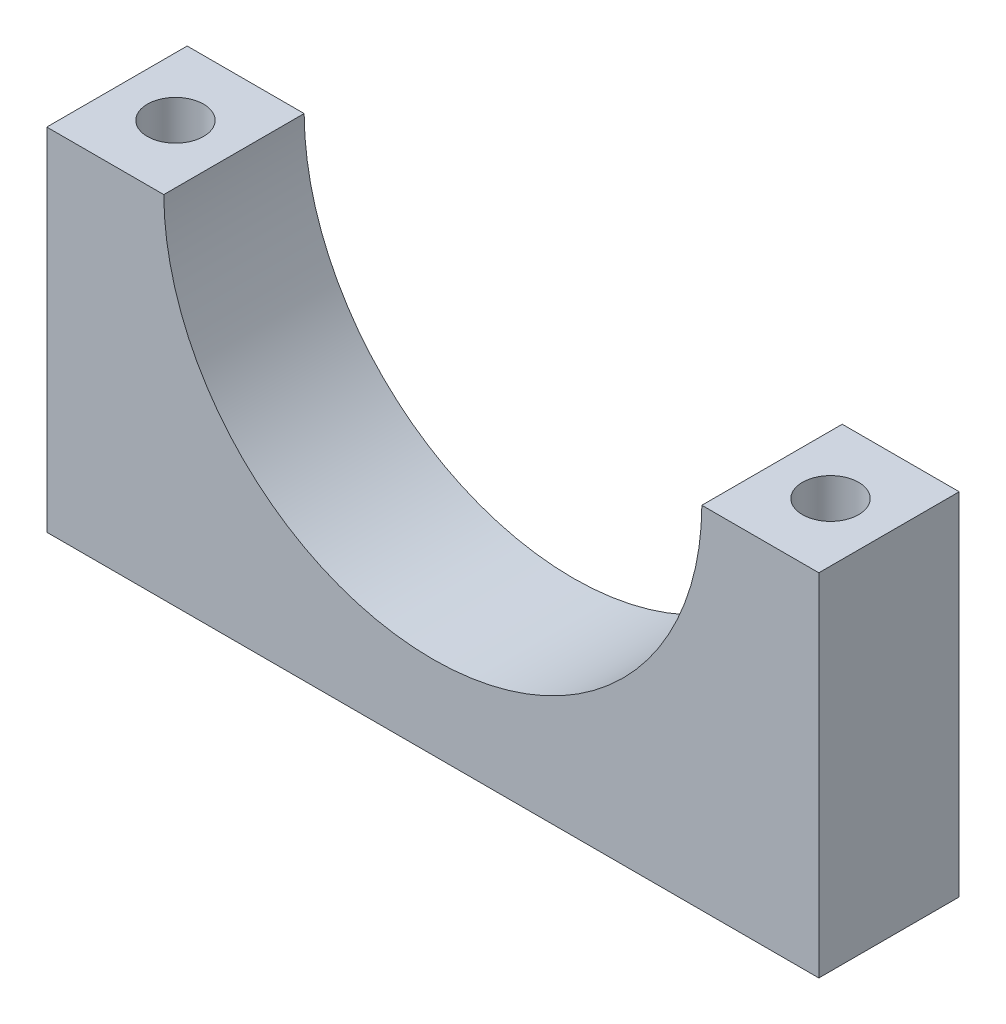
ISO-10303-21;
HEADER;
FILE_DESCRIPTION(('STEP AP214'),'2;1');
FILE_NAME('part.step','',(''),(''),'','','');
FILE_SCHEMA(('AUTOMOTIVE_DESIGN { 1 0 10303 214 1 1 1 1 }'));
ENDSEC;
DATA;
#1=APPLICATION_CONTEXT('core data for automotive mechanical design processes');
#2=APPLICATION_PROTOCOL_DEFINITION('international standard','automotive_design',2000,#1);
#3=PRODUCT_CONTEXT('',#1,'mechanical');
#4=PRODUCT('Part','Part','',(#3));
#5=PRODUCT_RELATED_PRODUCT_CATEGORY('part','',(#4));
#6=PRODUCT_DEFINITION_FORMATION('','',#4);
#7=PRODUCT_DEFINITION_CONTEXT('part definition',#1,'design');
#8=PRODUCT_DEFINITION('design','',#6,#7);
#9=PRODUCT_DEFINITION_SHAPE('','',#8);
#10=(LENGTH_UNIT() NAMED_UNIT(*) SI_UNIT(.MILLI.,.METRE.));
#11=(NAMED_UNIT(*) PLANE_ANGLE_UNIT() SI_UNIT($,.RADIAN.));
#12=(NAMED_UNIT(*) SI_UNIT($,.STERADIAN.) SOLID_ANGLE_UNIT());
#13=UNCERTAINTY_MEASURE_WITH_UNIT(LENGTH_MEASURE(1.E-05),#10,'distance_accuracy_value','');
#14=(GEOMETRIC_REPRESENTATION_CONTEXT(3) GLOBAL_UNCERTAINTY_ASSIGNED_CONTEXT((#13)) GLOBAL_UNIT_ASSIGNED_CONTEXT((#10,
#11,#12)) REPRESENTATION_CONTEXT('',''));
#15=CARTESIAN_POINT('',(0.,0.,0.));
#16=DIRECTION('',(0.,0.,1.));
#17=DIRECTION('',(1.,0.,0.));
#18=AXIS2_PLACEMENT_3D('',#15,#16,#17);
#19=CARTESIAN_POINT('',(0.,30.,12.));
#20=DIRECTION('',(0.,-1.,0.));
#21=DIRECTION('',(0.,0.,-1.));
#22=AXIS2_PLACEMENT_3D('',#19,#20,#21);
#23=PLANE('',#22);
#24=CARTESIAN_POINT('',(61.,30.,6.));
#25=DIRECTION('',(0.,-1.,0.));
#26=DIRECTION('',(0.,0.,-1.));
#27=AXIS2_PLACEMENT_3D('',#24,#25,#26);
#28=CIRCLE('',#27,2.39999999999999);
#29=CARTESIAN_POINT('',(61.,30.,3.60000000000001));
#30=VERTEX_POINT('',#29);
#31=EDGE_CURVE('E154',#30,#30,#28,.T.);
#32=ORIENTED_EDGE('',*,*,#31,.T.);
#33=EDGE_LOOP('',(#32));
#34=FACE_BOUND('',#33,.T.);
#35=DIRECTION('',(-1.,0.,0.));
#36=VECTOR('',#35,1.);
#37=CARTESIAN_POINT('',(0.,30.,0.));
#38=LINE('',#37,#36);
#39=CARTESIAN_POINT('',(66.,30.,0.));
#40=VERTEX_POINT('',#39);
#41=CARTESIAN_POINT('',(55.9997826076683,30.,0.));
#42=VERTEX_POINT('',#41);
#43=EDGE_CURVE('E107',#40,#42,#38,.T.);
#44=ORIENTED_EDGE('',*,*,#43,.T.);
#45=DIRECTION('',(0.,0.,1.));
#46=VECTOR('',#45,1.);
#47=CARTESIAN_POINT('',(55.9997826076683,30.,0.));
#48=LINE('',#47,#46);
#49=CARTESIAN_POINT('',(55.9997826076683,30.,12.));
#50=VERTEX_POINT('',#49);
#51=EDGE_CURVE('E48',#42,#50,#48,.T.);
#52=ORIENTED_EDGE('',*,*,#51,.T.);
#53=DIRECTION('',(-1.,0.,0.));
#54=VECTOR('',#53,1.);
#55=CARTESIAN_POINT('',(0.,30.,12.));
#56=LINE('',#55,#54);
#57=CARTESIAN_POINT('',(66.,30.,12.));
#58=VERTEX_POINT('',#57);
#59=EDGE_CURVE('E118',#58,#50,#56,.T.);
#60=ORIENTED_EDGE('',*,*,#59,.F.);
#61=DIRECTION('',(0.,0.,-1.));
#62=VECTOR('',#61,1.);
#63=CARTESIAN_POINT('',(66.,30.,12.));
#64=LINE('',#63,#62);
#65=EDGE_CURVE('E117',#58,#40,#64,.T.);
#66=ORIENTED_EDGE('',*,*,#65,.T.);
#67=EDGE_LOOP('',(#44,#52,#60,#66));
#68=FACE_BOUND('',#67,.T.);
#69=ADVANCED_FACE('F33',(#34,#68),#23,.F.);
#70=CARTESIAN_POINT('',(0.,0.,12.));
#71=DIRECTION('',(1.,0.,0.));
#72=DIRECTION('',(0.,0.,-1.));
#73=AXIS2_PLACEMENT_3D('',#70,#71,#72);
#74=PLANE('',#73);
#75=DIRECTION('',(0.,-1.,0.));
#76=VECTOR('',#75,1.);
#77=CARTESIAN_POINT('',(0.,0.,0.));
#78=LINE('',#77,#76);
#79=CARTESIAN_POINT('',(0.,30.,0.));
#80=VERTEX_POINT('',#79);
#81=CARTESIAN_POINT('',(0.,0.,0.));
#82=VERTEX_POINT('',#81);
#83=EDGE_CURVE('E106',#80,#82,#78,.T.);
#84=ORIENTED_EDGE('',*,*,#83,.T.);
#85=DIRECTION('',(0.,0.,-1.));
#86=VECTOR('',#85,1.);
#87=CARTESIAN_POINT('',(0.,0.,12.));
#88=LINE('',#87,#86);
#89=CARTESIAN_POINT('',(0.,0.,12.));
#90=VERTEX_POINT('',#89);
#91=EDGE_CURVE('E11',#90,#82,#88,.T.);
#92=ORIENTED_EDGE('',*,*,#91,.F.);
#93=DIRECTION('',(0.,-1.,0.));
#94=VECTOR('',#93,1.);
#95=CARTESIAN_POINT('',(0.,0.,12.));
#96=LINE('',#95,#94);
#97=CARTESIAN_POINT('',(0.,30.,12.));
#98=VERTEX_POINT('',#97);
#99=EDGE_CURVE('E110',#98,#90,#96,.T.);
#100=ORIENTED_EDGE('',*,*,#99,.F.);
#101=DIRECTION('',(0.,0.,-1.));
#102=VECTOR('',#101,1.);
#103=CARTESIAN_POINT('',(0.,30.,12.));
#104=LINE('',#103,#102);
#105=EDGE_CURVE('E115',#98,#80,#104,.T.);
#106=ORIENTED_EDGE('',*,*,#105,.T.);
#107=EDGE_LOOP('',(#84,#92,#100,#106));
#108=FACE_BOUND('',#107,.T.);
#109=ADVANCED_FACE('F35',(#108),#74,.F.);
#110=CARTESIAN_POINT('',(0.,0.,12.));
#111=DIRECTION('',(0.,1.,0.));
#112=DIRECTION('',(0.,0.,1.));
#113=AXIS2_PLACEMENT_3D('',#110,#111,#112);
#114=PLANE('',#113);
#115=CARTESIAN_POINT('',(61.,0.,6.));
#116=DIRECTION('',(0.,-1.,0.));
#117=DIRECTION('',(0.,0.,-1.));
#118=AXIS2_PLACEMENT_3D('',#115,#116,#117);
#119=CIRCLE('',#118,4.);
#120=CARTESIAN_POINT('',(61.,0.,2.));
#121=VERTEX_POINT('',#120);
#122=EDGE_CURVE('E163',#121,#121,#119,.T.);
#123=ORIENTED_EDGE('',*,*,#122,.F.);
#124=EDGE_LOOP('',(#123));
#125=FACE_BOUND('',#124,.T.);
#126=CARTESIAN_POINT('',(5.,0.,6.));
#127=DIRECTION('',(0.,-1.,0.));
#128=DIRECTION('',(0.,0.,-1.));
#129=AXIS2_PLACEMENT_3D('',#126,#127,#128);
#130=CIRCLE('',#129,3.99999999999999);
#131=CARTESIAN_POINT('',(5.,0.,2.00000000000001));
#132=VERTEX_POINT('',#131);
#133=EDGE_CURVE('E151',#132,#132,#130,.T.);
#134=ORIENTED_EDGE('',*,*,#133,.F.);
#135=EDGE_LOOP('',(#134));
#136=FACE_BOUND('',#135,.T.);
#137=DIRECTION('',(1.,0.,0.));
#138=VECTOR('',#137,1.);
#139=CARTESIAN_POINT('',(0.,0.,0.));
#140=LINE('',#139,#138);
#141=CARTESIAN_POINT('',(66.,0.,0.));
#142=VERTEX_POINT('',#141);
#143=EDGE_CURVE('E111',#82,#142,#140,.T.);
#144=ORIENTED_EDGE('',*,*,#143,.T.);
#145=DIRECTION('',(0.,0.,-1.));
#146=VECTOR('',#145,1.);
#147=CARTESIAN_POINT('',(66.,0.,12.));
#148=LINE('',#147,#146);
#149=CARTESIAN_POINT('',(66.,0.,12.));
#150=VERTEX_POINT('',#149);
#151=EDGE_CURVE('E41',#150,#142,#148,.T.);
#152=ORIENTED_EDGE('',*,*,#151,.F.);
#153=DIRECTION('',(1.,0.,0.));
#154=VECTOR('',#153,1.);
#155=CARTESIAN_POINT('',(0.,0.,12.));
#156=LINE('',#155,#154);
#157=EDGE_CURVE('E86',#90,#150,#156,.T.);
#158=ORIENTED_EDGE('',*,*,#157,.F.);
#159=ORIENTED_EDGE('',*,*,#91,.T.);
#160=EDGE_LOOP('',(#144,#152,#158,#159));
#161=FACE_BOUND('',#160,.T.);
#162=ADVANCED_FACE('F134',(#125,#136,#161),#114,.F.);
#163=CARTESIAN_POINT('',(66.,0.,12.));
#164=DIRECTION('',(-1.,0.,0.));
#165=DIRECTION('',(0.,0.,1.));
#166=AXIS2_PLACEMENT_3D('',#163,#164,#165);
#167=PLANE('',#166);
#168=DIRECTION('',(0.,1.,0.));
#169=VECTOR('',#168,1.);
#170=CARTESIAN_POINT('',(66.,0.,0.));
#171=LINE('',#170,#169);
#172=EDGE_CURVE('E108',#142,#40,#171,.T.);
#173=ORIENTED_EDGE('',*,*,#172,.T.);
#174=ORIENTED_EDGE('',*,*,#65,.F.);
#175=DIRECTION('',(0.,1.,0.));
#176=VECTOR('',#175,1.);
#177=CARTESIAN_POINT('',(66.,0.,12.));
#178=LINE('',#177,#176);
#179=EDGE_CURVE('E126',#150,#58,#178,.T.);
#180=ORIENTED_EDGE('',*,*,#179,.F.);
#181=ORIENTED_EDGE('',*,*,#151,.T.);
#182=EDGE_LOOP('',(#173,#174,#180,#181));
#183=FACE_BOUND('',#182,.T.);
#184=ADVANCED_FACE('F124',(#183),#167,.F.);
#185=CARTESIAN_POINT('',(5.,30.,6.));
#186=DIRECTION('',(0.,-1.,0.));
#187=DIRECTION('',(0.,0.,-1.));
#188=AXIS2_PLACEMENT_3D('',#185,#186,#187);
#189=CIRCLE('',#188,2.39999999999999);
#190=CARTESIAN_POINT('',(5.,30.,3.60000000000001));
#191=VERTEX_POINT('',#190);
#192=EDGE_CURVE('E141',#191,#191,#189,.T.);
#193=ORIENTED_EDGE('',*,*,#192,.T.);
#194=EDGE_LOOP('',(#193));
#195=FACE_BOUND('',#194,.T.);
#196=CARTESIAN_POINT('',(10.0002173923317,30.,12.));
#197=VERTEX_POINT('',#196);
#198=EDGE_CURVE('E57',#197,#98,#56,.T.);
#199=ORIENTED_EDGE('',*,*,#198,.F.);
#200=DIRECTION('',(0.,0.,1.));
#201=VECTOR('',#200,1.);
#202=CARTESIAN_POINT('',(10.0002173923317,30.,0.));
#203=LINE('',#202,#201);
#204=CARTESIAN_POINT('',(10.0002173923317,30.,0.));
#205=VERTEX_POINT('',#204);
#206=EDGE_CURVE('E95',#197,#205,#203,.F.);
#207=ORIENTED_EDGE('',*,*,#206,.T.);
#208=EDGE_CURVE('E79',#205,#80,#38,.T.);
#209=ORIENTED_EDGE('',*,*,#208,.T.);
#210=ORIENTED_EDGE('',*,*,#105,.F.);
#211=EDGE_LOOP('',(#199,#207,#209,#210));
#212=FACE_BOUND('',#211,.T.);
#213=ADVANCED_FACE('F101',(#195,#212),#23,.F.);
#214=CARTESIAN_POINT('',(0.,30.,12.));
#215=DIRECTION('',(0.,0.,-1.));
#216=DIRECTION('',(-1.,0.,0.));
#217=AXIS2_PLACEMENT_3D('',#214,#215,#216);
#218=PLANE('',#217);
#219=ORIENTED_EDGE('',*,*,#59,.T.);
#220=CARTESIAN_POINT('',(33.,30.1,12.));
#221=DIRECTION('',(0.,0.,1.));
#222=DIRECTION('',(1.,0.,0.));
#223=AXIS2_PLACEMENT_3D('',#220,#221,#222);
#224=CIRCLE('',#223,23.);
#225=EDGE_CURVE('E99',#197,#50,#224,.T.);
#226=ORIENTED_EDGE('',*,*,#225,.F.);
#227=ORIENTED_EDGE('',*,*,#198,.T.);
#228=ORIENTED_EDGE('',*,*,#99,.T.);
#229=ORIENTED_EDGE('',*,*,#157,.T.);
#230=ORIENTED_EDGE('',*,*,#179,.T.);
#231=EDGE_LOOP('',(#219,#226,#227,#228,#229,#230));
#232=FACE_BOUND('',#231,.T.);
#233=ADVANCED_FACE('F200',(#232),#218,.F.);
#234=CARTESIAN_POINT('',(0.,30.,0.));
#235=DIRECTION('',(0.,0.,-1.));
#236=DIRECTION('',(-1.,0.,0.));
#237=AXIS2_PLACEMENT_3D('',#234,#235,#236);
#238=PLANE('',#237);
#239=CARTESIAN_POINT('',(33.,30.1,0.));
#240=DIRECTION('',(0.,0.,1.));
#241=DIRECTION('',(1.,0.,0.));
#242=AXIS2_PLACEMENT_3D('',#239,#240,#241);
#243=CIRCLE('',#242,23.);
#244=EDGE_CURVE('E93',#205,#42,#243,.T.);
#245=ORIENTED_EDGE('',*,*,#244,.T.);
#246=ORIENTED_EDGE('',*,*,#43,.F.);
#247=ORIENTED_EDGE('',*,*,#172,.F.);
#248=ORIENTED_EDGE('',*,*,#143,.F.);
#249=ORIENTED_EDGE('',*,*,#83,.F.);
#250=ORIENTED_EDGE('',*,*,#208,.F.);
#251=EDGE_LOOP('',(#245,#246,#247,#248,#249,#250));
#252=FACE_BOUND('',#251,.T.);
#253=ADVANCED_FACE('F104',(#252),#238,.T.);
#254=CARTESIAN_POINT('',(33.,30.1,0.));
#255=DIRECTION('',(0.,0.,1.));
#256=DIRECTION('',(1.,0.,0.));
#257=AXIS2_PLACEMENT_3D('',#254,#255,#256);
#258=CYLINDRICAL_SURFACE('',#257,23.);
#259=ORIENTED_EDGE('',*,*,#244,.F.);
#260=ORIENTED_EDGE('',*,*,#206,.F.);
#261=ORIENTED_EDGE('',*,*,#225,.T.);
#262=ORIENTED_EDGE('',*,*,#51,.F.);
#263=EDGE_LOOP('',(#259,#260,#261,#262));
#264=FACE_BOUND('',#263,.T.);
#265=ADVANCED_FACE('F94',(#264),#258,.F.);
#266=CARTESIAN_POINT('',(5.,0.,6.));
#267=DIRECTION('',(0.,-1.,0.));
#268=DIRECTION('',(0.,0.,-1.));
#269=AXIS2_PLACEMENT_3D('',#266,#267,#268);
#270=CYLINDRICAL_SURFACE('',#269,2.4);
#271=ORIENTED_EDGE('',*,*,#192,.F.);
#272=EDGE_LOOP('',(#271));
#273=FACE_BOUND('',#272,.T.);
#274=CARTESIAN_POINT('',(5.,4.,6.));
#275=DIRECTION('',(0.,-1.,0.));
#276=DIRECTION('',(0.,0.,-1.));
#277=AXIS2_PLACEMENT_3D('',#274,#275,#276);
#278=CIRCLE('',#277,2.4);
#279=CARTESIAN_POINT('',(5.,4.,3.6));
#280=VERTEX_POINT('',#279);
#281=EDGE_CURVE('E145',#280,#280,#278,.T.);
#282=ORIENTED_EDGE('',*,*,#281,.T.);
#283=EDGE_LOOP('',(#282));
#284=FACE_BOUND('',#283,.T.);
#285=ADVANCED_FACE('F186',(#273,#284),#270,.F.);
#286=CARTESIAN_POINT('',(7.4,4.,6.));
#287=DIRECTION('',(0.,1.,0.));
#288=DIRECTION('',(0.,0.,1.));
#289=AXIS2_PLACEMENT_3D('',#286,#287,#288);
#290=PLANE('',#289);
#291=ORIENTED_EDGE('',*,*,#281,.F.);
#292=EDGE_LOOP('',(#291));
#293=FACE_BOUND('',#292,.T.);
#294=CARTESIAN_POINT('',(5.,4.,6.));
#295=DIRECTION('',(0.,-1.,0.));
#296=DIRECTION('',(0.,0.,-1.));
#297=AXIS2_PLACEMENT_3D('',#294,#295,#296);
#298=CIRCLE('',#297,4.);
#299=CARTESIAN_POINT('',(5.,4.,2.));
#300=VERTEX_POINT('',#299);
#301=EDGE_CURVE('E148',#300,#300,#298,.T.);
#302=ORIENTED_EDGE('',*,*,#301,.T.);
#303=EDGE_LOOP('',(#302));
#304=FACE_BOUND('',#303,.T.);
#305=ADVANCED_FACE('F176',(#293,#304),#290,.F.);
#306=CARTESIAN_POINT('',(5.,0.,6.));
#307=DIRECTION('',(0.,-1.,0.));
#308=DIRECTION('',(0.,0.,-1.));
#309=AXIS2_PLACEMENT_3D('',#306,#307,#308);
#310=CYLINDRICAL_SURFACE('',#309,3.99999999999999);
#311=ORIENTED_EDGE('',*,*,#301,.F.);
#312=EDGE_LOOP('',(#311));
#313=FACE_BOUND('',#312,.T.);
#314=ORIENTED_EDGE('',*,*,#133,.T.);
#315=EDGE_LOOP('',(#314));
#316=FACE_BOUND('',#315,.T.);
#317=ADVANCED_FACE('F173',(#313,#316),#310,.F.);
#318=CARTESIAN_POINT('',(61.,0.,6.));
#319=DIRECTION('',(0.,-1.,0.));
#320=DIRECTION('',(0.,0.,-1.));
#321=AXIS2_PLACEMENT_3D('',#318,#319,#320);
#322=CYLINDRICAL_SURFACE('',#321,2.39999999999999);
#323=ORIENTED_EDGE('',*,*,#31,.F.);
#324=EDGE_LOOP('',(#323));
#325=FACE_BOUND('',#324,.T.);
#326=CARTESIAN_POINT('',(61.,4.,6.));
#327=DIRECTION('',(0.,-1.,0.));
#328=DIRECTION('',(0.,0.,-1.));
#329=AXIS2_PLACEMENT_3D('',#326,#327,#328);
#330=CIRCLE('',#329,2.39999999999999);
#331=CARTESIAN_POINT('',(61.,4.,3.60000000000001));
#332=VERTEX_POINT('',#331);
#333=EDGE_CURVE('E157',#332,#332,#330,.T.);
#334=ORIENTED_EDGE('',*,*,#333,.T.);
#335=EDGE_LOOP('',(#334));
#336=FACE_BOUND('',#335,.T.);
#337=ADVANCED_FACE('F175',(#325,#336),#322,.F.);
#338=CARTESIAN_POINT('',(63.4,4.,6.));
#339=DIRECTION('',(0.,1.,0.));
#340=DIRECTION('',(0.,0.,1.));
#341=AXIS2_PLACEMENT_3D('',#338,#339,#340);
#342=PLANE('',#341);
#343=ORIENTED_EDGE('',*,*,#333,.F.);
#344=EDGE_LOOP('',(#343));
#345=FACE_BOUND('',#344,.T.);
#346=CARTESIAN_POINT('',(61.,4.,6.));
#347=DIRECTION('',(0.,-1.,0.));
#348=DIRECTION('',(0.,0.,-1.));
#349=AXIS2_PLACEMENT_3D('',#346,#347,#348);
#350=CIRCLE('',#349,4.);
#351=CARTESIAN_POINT('',(61.,4.,2.));
#352=VERTEX_POINT('',#351);
#353=EDGE_CURVE('E160',#352,#352,#350,.T.);
#354=ORIENTED_EDGE('',*,*,#353,.T.);
#355=EDGE_LOOP('',(#354));
#356=FACE_BOUND('',#355,.T.);
#357=ADVANCED_FACE('F183',(#345,#356),#342,.F.);
#358=CARTESIAN_POINT('',(61.,0.,6.));
#359=DIRECTION('',(0.,-1.,0.));
#360=DIRECTION('',(0.,0.,-1.));
#361=AXIS2_PLACEMENT_3D('',#358,#359,#360);
#362=CYLINDRICAL_SURFACE('',#361,4.);
#363=ORIENTED_EDGE('',*,*,#353,.F.);
#364=EDGE_LOOP('',(#363));
#365=FACE_BOUND('',#364,.T.);
#366=ORIENTED_EDGE('',*,*,#122,.T.);
#367=EDGE_LOOP('',(#366));
#368=FACE_BOUND('',#367,.T.);
#369=ADVANCED_FACE('F167',(#365,#368),#362,.F.);
#370=CLOSED_SHELL('',(#69,#109,#162,#184,#213,#233,#253,#265,#285,#305,#317,#337,#357,#369));
#371=MANIFOLD_SOLID_BREP('B2',#370);
#372=ADVANCED_BREP_SHAPE_REPRESENTATION('',(#18,#371),#14);
#373=SHAPE_DEFINITION_REPRESENTATION(#9,#372);
ENDSEC;
END-ISO-10303-21;
